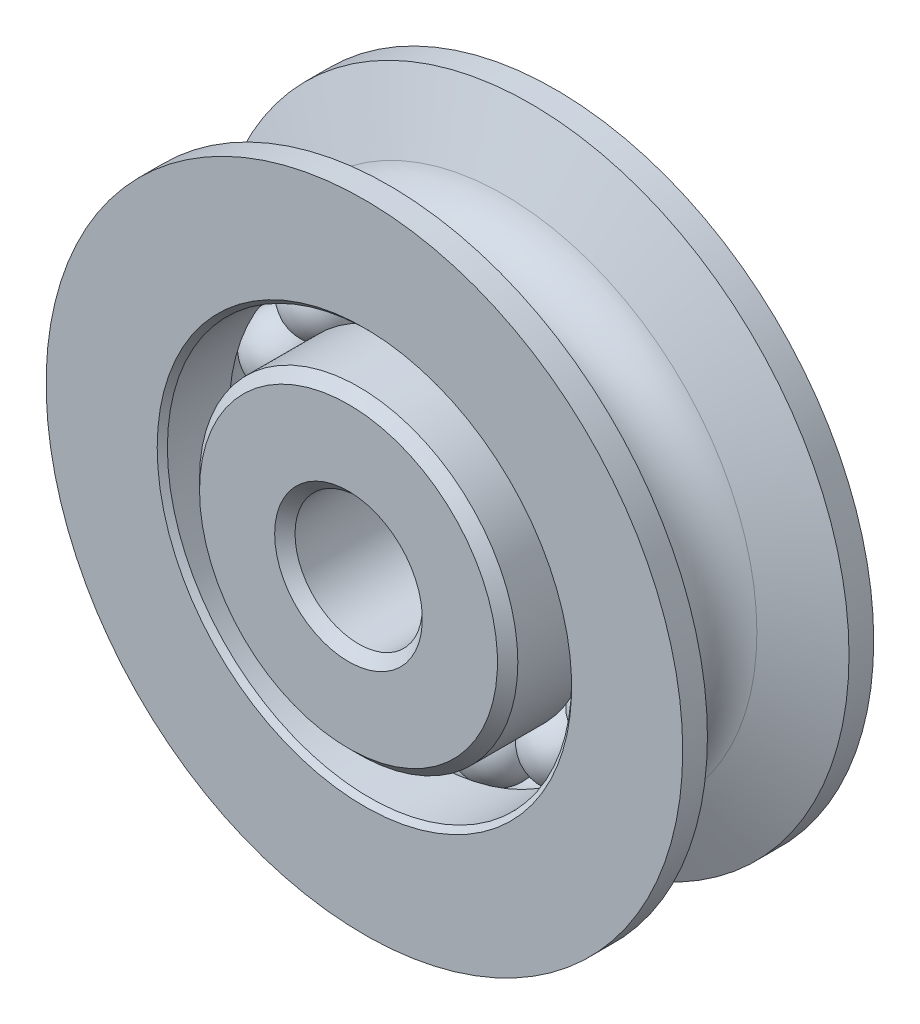
ISO-10303-21;
HEADER;
FILE_DESCRIPTION(('STEP AP214'),'2;1');
FILE_NAME('part.step','',(''),(''),'','','');
FILE_SCHEMA(('AUTOMOTIVE_DESIGN { 1 0 10303 214 1 1 1 1 }'));
ENDSEC;
DATA;
#1=APPLICATION_CONTEXT('core data for automotive mechanical design processes');
#2=APPLICATION_PROTOCOL_DEFINITION('international standard','automotive_design',2000,#1);
#3=PRODUCT_CONTEXT('',#1,'mechanical');
#4=PRODUCT('Part','Part','',(#3));
#5=PRODUCT_RELATED_PRODUCT_CATEGORY('part','',(#4));
#6=PRODUCT_DEFINITION_FORMATION('','',#4);
#7=PRODUCT_DEFINITION_CONTEXT('part definition',#1,'design');
#8=PRODUCT_DEFINITION('design','',#6,#7);
#9=PRODUCT_DEFINITION_SHAPE('','',#8);
#10=(LENGTH_UNIT() NAMED_UNIT(*) SI_UNIT(.MILLI.,.METRE.));
#11=(NAMED_UNIT(*) PLANE_ANGLE_UNIT() SI_UNIT($,.RADIAN.));
#12=(NAMED_UNIT(*) SI_UNIT($,.STERADIAN.) SOLID_ANGLE_UNIT());
#13=UNCERTAINTY_MEASURE_WITH_UNIT(LENGTH_MEASURE(1.E-05),#10,'distance_accuracy_value','');
#14=(GEOMETRIC_REPRESENTATION_CONTEXT(3) GLOBAL_UNCERTAINTY_ASSIGNED_CONTEXT((#13)) GLOBAL_UNIT_ASSIGNED_CONTEXT((#10,
#11,#12)) REPRESENTATION_CONTEXT('',''));
#15=CARTESIAN_POINT('',(0.,0.,0.));
#16=DIRECTION('',(0.,0.,1.));
#17=DIRECTION('',(1.,0.,0.));
#18=AXIS2_PLACEMENT_3D('',#15,#16,#17);
#19=CARTESIAN_POINT('',(3.66431583850997,8.23018812449334,0.));
#20=DIRECTION('',(0.406736643075789,0.913545457642606,0.));
#21=DIRECTION('',(0.,0.,-1.));
#22=AXIS2_PLACEMENT_3D('',#19,#20,#21);
#23=SPHERICAL_SURFACE('',#22,1.7859375);
#24=CARTESIAN_POINT('',(4.39072206200314,9.86172321525193,0.));
#25=VERTEX_POINT('',#24);
#26=VERTEX_LOOP('',#25);
#27=FACE_BOUND('',#26,.T.);
#28=ADVANCED_FACE('F34',(#27),#23,.T.);
#29=CLOSED_SHELL('',(#28));
#30=MANIFOLD_SOLID_BREP('B2',#29);
#31=CARTESIAN_POINT('',(6.69503817927736,6.02823945334993,0.));
#32=DIRECTION('',(0.743144825477386,0.669130606358867,0.));
#33=DIRECTION('',(0.,0.,-1.));
#34=AXIS2_PLACEMENT_3D('',#31,#32,#33);
#35=SPHERICAL_SURFACE('',#34,1.7859375);
#36=CARTESIAN_POINT('',(8.02224839102838,7.22326489564397,0.));
#37=VERTEX_POINT('',#36);
#38=VERTEX_LOOP('',#37);
#39=FACE_BOUND('',#38,.T.);
#40=ADVANCED_FACE('F53',(#39),#35,.T.);
#41=CLOSED_SHELL('',(#40));
#42=MANIFOLD_SOLID_BREP('B6',#41);
#43=CARTESIAN_POINT('',(8.56812759633528,2.78395341588614,0.));
#44=DIRECTION('',(0.95105651629515,0.309016994374957,0.));
#45=DIRECTION('',(0.,0.,-1.));
#46=AXIS2_PLACEMENT_3D('',#43,#44,#45);
#47=SPHERICAL_SURFACE('',#46,1.7859375);
#48=CARTESIAN_POINT('',(10.2666550934061,3.33583845427766,0.));
#49=VERTEX_POINT('',#48);
#50=VERTEX_LOOP('',#49);
#51=FACE_BOUND('',#50,.T.);
#52=ADVANCED_FACE('F72',(#51),#47,.T.);
#53=CLOSED_SHELL('',(#52));
#54=MANIFOLD_SOLID_BREP('B30',#53);
#55=CARTESIAN_POINT('',(8.95970991299125,-0.941703458607156,0.));
#56=DIRECTION('',(0.994521895368274,-0.104528463267644,0.));
#57=DIRECTION('',(0.,0.,-1.));
#58=AXIS2_PLACEMENT_3D('',#55,#56,#57);
#59=SPHERICAL_SURFACE('',#58,1.7859375);
#60=CARTESIAN_POINT('',(10.7358638605005,-1.12838476097421,0.));
#61=VERTEX_POINT('',#60);
#62=VERTEX_LOOP('',#61);
#63=FACE_BOUND('',#62,.T.);
#64=ADVANCED_FACE('F91',(#63),#59,.T.);
#65=CLOSED_SHELL('',(#64));
#66=MANIFOLD_SOLID_BREP('B49',#65);
#67=CARTESIAN_POINT('',(7.80207698928179,-4.50453124999993,0.));
#68=DIRECTION('',(0.866025403784443,-0.499999999999992,0.));
#69=DIRECTION('',(0.,0.,-1.));
#70=AXIS2_PLACEMENT_3D('',#67,#68,#69);
#71=SPHERICAL_SURFACE('',#70,1.7859375);
#72=CARTESIAN_POINT('',(9.34874423385306,-5.39749999999991,0.));
#73=VERTEX_POINT('',#72);
#74=VERTEX_LOOP('',#73);
#75=FACE_BOUND('',#74,.T.);
#76=ADVANCED_FACE('F110',(#75),#71,.T.);
#77=CLOSED_SHELL('',(#76));
#78=MANIFOLD_SOLID_BREP('B68',#77);
#79=CARTESIAN_POINT('',(5.29539407448122,-7.28848466588601,0.));
#80=DIRECTION('',(0.58778525229248,-0.809016994374943,0.));
#81=DIRECTION('',(0.,0.,-1.));
#82=AXIS2_PLACEMENT_3D('',#79,#80,#81);
#83=SPHERICAL_SURFACE('',#82,1.7859375);
#84=CARTESIAN_POINT('',(6.34514179849732,-8.7333384542775,0.));
#85=VERTEX_POINT('',#84);
#86=VERTEX_LOOP('',#85);
#87=FACE_BOUND('',#86,.T.);
#88=ADVANCED_FACE('F129',(#87),#83,.T.);
#89=CLOSED_SHELL('',(#88));
#90=MANIFOLD_SOLID_BREP('B87',#89);
#91=CARTESIAN_POINT('',(1.87308941705793,-8.81219286923589,0.));
#92=DIRECTION('',(0.207911690817766,-0.978147600733804,0.));
#93=DIRECTION('',(0.,0.,-1.));
#94=AXIS2_PLACEMENT_3D('',#91,#92,#93);
#95=SPHERICAL_SURFACE('',#94,1.7859375);
#96=CARTESIAN_POINT('',(2.24440670237779,-10.5591033499214,0.));
#97=VERTEX_POINT('',#96);
#98=VERTEX_LOOP('',#97);
#99=FACE_BOUND('',#98,.T.);
#100=ADVANCED_FACE('F148',(#99),#95,.T.);
#101=CLOSED_SHELL('',(#100));
#102=MANIFOLD_SOLID_BREP('B106',#101);
#103=CARTESIAN_POINT('',(-1.87308941705781,-8.81219286923591,0.));
#104=DIRECTION('',(-0.207911690817753,-0.978147600733807,0.));
#105=DIRECTION('',(0.,0.,-1.));
#106=AXIS2_PLACEMENT_3D('',#103,#104,#105);
#107=SPHERICAL_SURFACE('',#106,1.7859375);
#108=CARTESIAN_POINT('',(-2.24440670237765,-10.5591033499214,0.));
#109=VERTEX_POINT('',#108);
#110=VERTEX_LOOP('',#109);
#111=FACE_BOUND('',#110,.T.);
#112=ADVANCED_FACE('F167',(#111),#107,.T.);
#113=CLOSED_SHELL('',(#112));
#114=MANIFOLD_SOLID_BREP('B125',#113);
#115=CARTESIAN_POINT('',(-5.29539407448112,-7.28848466588608,0.));
#116=DIRECTION('',(-0.587785252292469,-0.80901699437495,0.));
#117=DIRECTION('',(0.,0.,-1.));
#118=AXIS2_PLACEMENT_3D('',#115,#116,#117);
#119=SPHERICAL_SURFACE('',#118,1.7859375);
#120=CARTESIAN_POINT('',(-6.3451417984972,-8.73333845427759,0.));
#121=VERTEX_POINT('',#120);
#122=VERTEX_LOOP('',#121);
#123=FACE_BOUND('',#122,.T.);
#124=ADVANCED_FACE('F186',(#123),#119,.T.);
#125=CLOSED_SHELL('',(#124));
#126=MANIFOLD_SOLID_BREP('B144',#125);
#127=CARTESIAN_POINT('',(-7.80207698928172,-4.50453125000004,0.));
#128=DIRECTION('',(-0.866025403784436,-0.500000000000004,0.));
#129=DIRECTION('',(0.,0.,-1.));
#130=AXIS2_PLACEMENT_3D('',#127,#128,#129);
#131=SPHERICAL_SURFACE('',#130,1.7859375);
#132=CARTESIAN_POINT('',(-9.34874423385299,-5.39750000000004,0.));
#133=VERTEX_POINT('',#132);
#134=VERTEX_LOOP('',#133);
#135=FACE_BOUND('',#134,.T.);
#136=ADVANCED_FACE('F205',(#135),#131,.T.);
#137=CLOSED_SHELL('',(#136));
#138=MANIFOLD_SOLID_BREP('B163',#137);
#139=CARTESIAN_POINT('',(-8.95970991299123,-0.941703458607277,0.));
#140=DIRECTION('',(-0.994521895368273,-0.104528463267657,0.));
#141=DIRECTION('',(0.,0.,-1.));
#142=AXIS2_PLACEMENT_3D('',#139,#140,#141);
#143=SPHERICAL_SURFACE('',#142,1.7859375);
#144=CARTESIAN_POINT('',(-10.7358638605005,-1.12838476097436,0.));
#145=VERTEX_POINT('',#144);
#146=VERTEX_LOOP('',#145);
#147=FACE_BOUND('',#146,.T.);
#148=ADVANCED_FACE('F224',(#147),#143,.T.);
#149=CLOSED_SHELL('',(#148));
#150=MANIFOLD_SOLID_BREP('B182',#149);
#151=CARTESIAN_POINT('',(-8.56812759633531,2.78395341588603,0.));
#152=DIRECTION('',(-0.951056516295154,0.309016994374945,0.));
#153=DIRECTION('',(0.,0.,-1.));
#154=AXIS2_PLACEMENT_3D('',#151,#152,#153);
#155=SPHERICAL_SURFACE('',#154,1.7859375);
#156=CARTESIAN_POINT('',(-10.2666550934062,3.33583845427753,0.));
#157=VERTEX_POINT('',#156);
#158=VERTEX_LOOP('',#157);
#159=FACE_BOUND('',#158,.T.);
#160=ADVANCED_FACE('F243',(#159),#155,.T.);
#161=CLOSED_SHELL('',(#160));
#162=MANIFOLD_SOLID_BREP('B201',#161);
#163=CARTESIAN_POINT('',(-6.69503817927745,6.02823945334984,0.));
#164=DIRECTION('',(-0.743144825477395,0.669130606358857,0.));
#165=DIRECTION('',(0.,0.,-1.));
#166=AXIS2_PLACEMENT_3D('',#163,#164,#165);
#167=SPHERICAL_SURFACE('',#166,1.7859375);
#168=CARTESIAN_POINT('',(-8.02224839102848,7.22326489564386,0.));
#169=VERTEX_POINT('',#168);
#170=VERTEX_LOOP('',#169);
#171=FACE_BOUND('',#170,.T.);
#172=ADVANCED_FACE('F262',(#171),#167,.T.);
#173=CLOSED_SHELL('',(#172));
#174=MANIFOLD_SOLID_BREP('B220',#173);
#175=CARTESIAN_POINT('',(-3.66431583851008,8.23018812449329,0.));
#176=DIRECTION('',(-0.406736643075801,0.913545457642601,0.));
#177=DIRECTION('',(0.,0.,-1.));
#178=AXIS2_PLACEMENT_3D('',#175,#176,#177);
#179=SPHERICAL_SURFACE('',#178,1.7859375);
#180=CARTESIAN_POINT('',(-4.39072206200327,9.86172321525187,0.));
#181=VERTEX_POINT('',#180);
#182=VERTEX_LOOP('',#181);
#183=FACE_BOUND('',#182,.T.);
#184=ADVANCED_FACE('F281',(#183),#179,.T.);
#185=CLOSED_SHELL('',(#184));
#186=MANIFOLD_SOLID_BREP('B239',#185);
#187=CARTESIAN_POINT('',(0.,9.0090625,0.));
#188=DIRECTION('',(0.,1.,0.));
#189=DIRECTION('',(0.,0.,-1.));
#190=AXIS2_PLACEMENT_3D('',#187,#188,#189);
#191=SPHERICAL_SURFACE('',#190,1.7859375);
#192=CARTESIAN_POINT('',(0.,10.795,0.));
#193=VERTEX_POINT('',#192);
#194=VERTEX_LOOP('',#193);
#195=FACE_BOUND('',#194,.T.);
#196=ADVANCED_FACE('F302',(#195),#191,.T.);
#197=CLOSED_SHELL('',(#196));
#198=MANIFOLD_SOLID_BREP('B258',#197);
#199=CARTESIAN_POINT('',(0.,7.9375,5.55625));
#200=DIRECTION('',(0.,0.,-1.));
#201=DIRECTION('',(-1.,0.,0.));
#202=AXIS2_PLACEMENT_3D('',#199,#200,#201);
#203=PLANE('',#202);
#204=CARTESIAN_POINT('',(0.,0.,5.55625));
#205=DIRECTION('',(0.,0.,-1.));
#206=DIRECTION('',(-1.,0.,0.));
#207=AXIS2_PLACEMENT_3D('',#204,#205,#206);
#208=CIRCLE('',#207,7.4295);
#209=CARTESIAN_POINT('',(-7.4295,0.,5.55625));
#210=VERTEX_POINT('',#209);
#211=EDGE_CURVE('E329',#210,#210,#208,.F.);
#212=ORIENTED_EDGE('',*,*,#211,.T.);
#213=EDGE_LOOP('',(#212));
#214=FACE_BOUND('',#213,.T.);
#215=CARTESIAN_POINT('',(0.,0.,5.55625));
#216=DIRECTION('',(0.,0.,-1.));
#217=DIRECTION('',(-1.,0.,0.));
#218=AXIS2_PLACEMENT_3D('',#215,#216,#217);
#219=CIRCLE('',#218,3.683);
#220=CARTESIAN_POINT('',(-3.683,0.,5.55625));
#221=VERTEX_POINT('',#220);
#222=EDGE_CURVE('E333',#221,#221,#219,.T.);
#223=ORIENTED_EDGE('',*,*,#222,.T.);
#224=EDGE_LOOP('',(#223));
#225=FACE_BOUND('',#224,.T.);
#226=ADVANCED_FACE('F322',(#214,#225),#203,.F.);
#227=CARTESIAN_POINT('',(0.,0.,5.55625));
#228=DIRECTION('',(0.,0.,1.));
#229=DIRECTION('',(1.,0.,0.));
#230=AXIS2_PLACEMENT_3D('',#227,#228,#229);
#231=CYLINDRICAL_SURFACE('',#230,3.175);
#232=CARTESIAN_POINT('',(0.,0.,-5.04825));
#233=DIRECTION('',(0.,0.,1.));
#234=DIRECTION('',(1.,0.,0.));
#235=AXIS2_PLACEMENT_3D('',#232,#233,#234);
#236=CIRCLE('',#235,3.175);
#237=CARTESIAN_POINT('',(3.175,0.,-5.04825));
#238=VERTEX_POINT('',#237);
#239=EDGE_CURVE('E342',#238,#238,#236,.F.);
#240=ORIENTED_EDGE('',*,*,#239,.T.);
#241=EDGE_LOOP('',(#240));
#242=FACE_BOUND('',#241,.T.);
#243=CARTESIAN_POINT('',(0.,0.,5.04825));
#244=DIRECTION('',(0.,0.,-1.));
#245=DIRECTION('',(-1.,0.,0.));
#246=AXIS2_PLACEMENT_3D('',#243,#244,#245);
#247=CIRCLE('',#246,3.175);
#248=CARTESIAN_POINT('',(-3.175,0.,5.04825));
#249=VERTEX_POINT('',#248);
#250=EDGE_CURVE('E345',#249,#249,#247,.F.);
#251=ORIENTED_EDGE('',*,*,#250,.T.);
#252=EDGE_LOOP('',(#251));
#253=FACE_BOUND('',#252,.T.);
#254=ADVANCED_FACE('F377',(#242,#253),#231,.F.);
#255=CARTESIAN_POINT('',(0.,7.9375,-5.55625));
#256=DIRECTION('',(0.,0.,1.));
#257=DIRECTION('',(1.,0.,0.));
#258=AXIS2_PLACEMENT_3D('',#255,#256,#257);
#259=PLANE('',#258);
#260=CARTESIAN_POINT('',(0.,0.,-5.55625));
#261=DIRECTION('',(0.,0.,1.));
#262=DIRECTION('',(1.,0.,0.));
#263=AXIS2_PLACEMENT_3D('',#260,#261,#262);
#264=CIRCLE('',#263,3.683);
#265=CARTESIAN_POINT('',(3.683,0.,-5.55625));
#266=VERTEX_POINT('',#265);
#267=EDGE_CURVE('E348',#266,#266,#264,.T.);
#268=ORIENTED_EDGE('',*,*,#267,.T.);
#269=EDGE_LOOP('',(#268));
#270=FACE_BOUND('',#269,.T.);
#271=CARTESIAN_POINT('',(0.,0.,-5.55625));
#272=DIRECTION('',(0.,0.,1.));
#273=DIRECTION('',(1.,0.,0.));
#274=AXIS2_PLACEMENT_3D('',#271,#272,#273);
#275=CIRCLE('',#274,7.4295);
#276=CARTESIAN_POINT('',(7.4295,0.,-5.55625));
#277=VERTEX_POINT('',#276);
#278=EDGE_CURVE('E351',#277,#277,#275,.F.);
#279=ORIENTED_EDGE('',*,*,#278,.T.);
#280=EDGE_LOOP('',(#279));
#281=FACE_BOUND('',#280,.T.);
#282=ADVANCED_FACE('F371',(#270,#281),#259,.F.);
#283=CARTESIAN_POINT('',(0.,0.,5.55625));
#284=DIRECTION('',(0.,0.,1.));
#285=DIRECTION('',(1.,0.,0.));
#286=AXIS2_PLACEMENT_3D('',#283,#284,#285);
#287=CYLINDRICAL_SURFACE('',#286,7.9375);
#288=CARTESIAN_POINT('',(0.,0.,-5.04825));
#289=DIRECTION('',(0.,0.,1.));
#290=DIRECTION('',(1.,0.,0.));
#291=AXIS2_PLACEMENT_3D('',#288,#289,#290);
#292=CIRCLE('',#291,7.9375);
#293=CARTESIAN_POINT('',(7.9375,0.,-5.04825));
#294=VERTEX_POINT('',#293);
#295=EDGE_CURVE('E337',#294,#294,#292,.T.);
#296=ORIENTED_EDGE('',*,*,#295,.T.);
#297=EDGE_LOOP('',(#296));
#298=FACE_BOUND('',#297,.T.);
#299=CARTESIAN_POINT('',(0.,0.,-1.42875));
#300=DIRECTION('',(0.,0.,1.));
#301=DIRECTION('',(1.,0.,0.));
#302=AXIS2_PLACEMENT_3D('',#299,#300,#301);
#303=CIRCLE('',#302,7.9375);
#304=CARTESIAN_POINT('',(7.9375,0.,-1.42875));
#305=VERTEX_POINT('',#304);
#306=EDGE_CURVE('E354',#305,#305,#303,.T.);
#307=ORIENTED_EDGE('',*,*,#306,.F.);
#308=EDGE_LOOP('',(#307));
#309=FACE_BOUND('',#308,.T.);
#310=ADVANCED_FACE('F366',(#298,#309),#287,.T.);
#311=CARTESIAN_POINT('',(0.,0.,0.));
#312=DIRECTION('',(0.,0.,1.));
#313=DIRECTION('',(1.,0.,0.));
#314=AXIS2_PLACEMENT_3D('',#311,#312,#313);
#315=TOROIDAL_SURFACE('',#314,9.0090625,1.7859375);
#316=CARTESIAN_POINT('',(0.,0.,1.42875));
#317=DIRECTION('',(0.,0.,1.));
#318=DIRECTION('',(1.,0.,0.));
#319=AXIS2_PLACEMENT_3D('',#316,#317,#318);
#320=CIRCLE('',#319,7.9375);
#321=CARTESIAN_POINT('',(7.9375,0.,1.42875));
#322=VERTEX_POINT('',#321);
#323=EDGE_CURVE('E357',#322,#322,#320,.T.);
#324=ORIENTED_EDGE('',*,*,#323,.F.);
#325=EDGE_LOOP('',(#324));
#326=FACE_BOUND('',#325,.T.);
#327=ORIENTED_EDGE('',*,*,#306,.T.);
#328=EDGE_LOOP('',(#327));
#329=FACE_BOUND('',#328,.T.);
#330=ADVANCED_FACE('F363',(#326,#329),#315,.F.);
#331=CARTESIAN_POINT('',(0.,0.,5.55625));
#332=DIRECTION('',(0.,0.,1.));
#333=DIRECTION('',(1.,0.,0.));
#334=AXIS2_PLACEMENT_3D('',#331,#332,#333);
#335=CYLINDRICAL_SURFACE('',#334,7.9375);
#336=CARTESIAN_POINT('',(0.,0.,5.04825));
#337=DIRECTION('',(0.,0.,-1.));
#338=DIRECTION('',(-1.,0.,0.));
#339=AXIS2_PLACEMENT_3D('',#336,#337,#338);
#340=CIRCLE('',#339,7.9375);
#341=CARTESIAN_POINT('',(-7.9375,0.,5.04825));
#342=VERTEX_POINT('',#341);
#343=EDGE_CURVE('E301',#342,#342,#340,.T.);
#344=ORIENTED_EDGE('',*,*,#343,.T.);
#345=EDGE_LOOP('',(#344));
#346=FACE_BOUND('',#345,.T.);
#347=ORIENTED_EDGE('',*,*,#323,.T.);
#348=EDGE_LOOP('',(#347));
#349=FACE_BOUND('',#348,.T.);
#350=ADVANCED_FACE('F361',(#346,#349),#335,.T.);
#351=CARTESIAN_POINT('',(0.,0.,-5.55625));
#352=DIRECTION('',(0.,0.,-1.));
#353=DIRECTION('',(-1.,0.,0.));
#354=AXIS2_PLACEMENT_3D('',#351,#352,#353);
#355=CONICAL_SURFACE('',#354,3.683,0.785398163397446);
#356=ORIENTED_EDGE('',*,*,#239,.F.);
#357=EDGE_LOOP('',(#356));
#358=FACE_BOUND('',#357,.T.);
#359=ORIENTED_EDGE('',*,*,#267,.F.);
#360=EDGE_LOOP('',(#359));
#361=FACE_BOUND('',#360,.T.);
#362=ADVANCED_FACE('F389',(#358,#361),#355,.F.);
#363=CARTESIAN_POINT('',(0.,0.,-5.04825));
#364=DIRECTION('',(0.,0.,1.));
#365=DIRECTION('',(1.,0.,0.));
#366=AXIS2_PLACEMENT_3D('',#363,#364,#365);
#367=CONICAL_SURFACE('',#366,7.9375,0.785398163397448);
#368=ORIENTED_EDGE('',*,*,#278,.F.);
#369=EDGE_LOOP('',(#368));
#370=FACE_BOUND('',#369,.T.);
#371=ORIENTED_EDGE('',*,*,#295,.F.);
#372=EDGE_LOOP('',(#371));
#373=FACE_BOUND('',#372,.T.);
#374=ADVANCED_FACE('F392',(#370,#373),#367,.T.);
#375=CARTESIAN_POINT('',(0.,0.,5.55625));
#376=DIRECTION('',(0.,0.,-1.));
#377=DIRECTION('',(-1.,0.,0.));
#378=AXIS2_PLACEMENT_3D('',#375,#376,#377);
#379=CONICAL_SURFACE('',#378,7.4295,0.785398163397448);
#380=ORIENTED_EDGE('',*,*,#343,.F.);
#381=EDGE_LOOP('',(#380));
#382=FACE_BOUND('',#381,.T.);
#383=ORIENTED_EDGE('',*,*,#211,.F.);
#384=EDGE_LOOP('',(#383));
#385=FACE_BOUND('',#384,.T.);
#386=ADVANCED_FACE('F395',(#382,#385),#379,.T.);
#387=CARTESIAN_POINT('',(0.,0.,5.04825));
#388=DIRECTION('',(0.,0.,1.));
#389=DIRECTION('',(1.,0.,0.));
#390=AXIS2_PLACEMENT_3D('',#387,#388,#389);
#391=CONICAL_SURFACE('',#390,3.175,0.785398163397448);
#392=ORIENTED_EDGE('',*,*,#222,.F.);
#393=EDGE_LOOP('',(#392));
#394=FACE_BOUND('',#393,.T.);
#395=ORIENTED_EDGE('',*,*,#250,.F.);
#396=EDGE_LOOP('',(#395));
#397=FACE_BOUND('',#396,.T.);
#398=ADVANCED_FACE('F324',(#394,#397),#391,.F.);
#399=CLOSED_SHELL('',(#226,#254,#282,#310,#330,#350,#362,#374,#386,#398));
#400=MANIFOLD_SOLID_BREP('B277',#399);
#401=CARTESIAN_POINT('',(0.,0.,0.));
#402=DIRECTION('',(0.,0.,1.));
#403=DIRECTION('',(1.,0.,0.));
#404=AXIS2_PLACEMENT_3D('',#401,#402,#403);
#405=TOROIDAL_SURFACE('',#404,13.49375,2.38125);
#406=CARTESIAN_POINT('',(0.,0.,2.20779758582892));
#407=DIRECTION('',(0.,0.,1.));
#408=DIRECTION('',(1.,0.,0.));
#409=AXIS2_PLACEMENT_3D('',#406,#407,#408);
#410=CIRCLE('',#409,12.6015721127443);
#411=CARTESIAN_POINT('',(12.6015721127443,0.,2.20779758582892));
#412=VERTEX_POINT('',#411);
#413=EDGE_CURVE('E494',#412,#412,#410,.T.);
#414=ORIENTED_EDGE('',*,*,#413,.F.);
#415=EDGE_LOOP('',(#414));
#416=FACE_BOUND('',#415,.T.);
#417=CARTESIAN_POINT('',(0.,0.,-2.20779758582892));
#418=DIRECTION('',(0.,0.,1.));
#419=DIRECTION('',(1.,0.,0.));
#420=AXIS2_PLACEMENT_3D('',#417,#418,#419);
#421=CIRCLE('',#420,12.6015721127443);
#422=CARTESIAN_POINT('',(12.6015721127443,0.,-2.20779758582892));
#423=VERTEX_POINT('',#422);
#424=EDGE_CURVE('E515',#423,#423,#421,.T.);
#425=ORIENTED_EDGE('',*,*,#424,.T.);
#426=EDGE_LOOP('',(#425));
#427=FACE_BOUND('',#426,.T.);
#428=ADVANCED_FACE('F474',(#416,#427),#405,.F.);
#429=CARTESIAN_POINT('',(0.,0.,2.20779758582892));
#430=DIRECTION('',(0.,0.,1.));
#431=DIRECTION('',(1.,0.,0.));
#432=AXIS2_PLACEMENT_3D('',#429,#430,#431);
#433=CONICAL_SURFACE('',#432,12.6015721127443,1.18675779166655);
#434=CARTESIAN_POINT('',(0.,0.,3.5306));
#435=DIRECTION('',(0.,0.,1.));
#436=DIRECTION('',(1.,0.,0.));
#437=AXIS2_PLACEMENT_3D('',#434,#435,#436);
#438=CIRCLE('',#437,15.875);
#439=CARTESIAN_POINT('',(15.875,0.,3.5306));
#440=VERTEX_POINT('',#439);
#441=EDGE_CURVE('E497',#440,#440,#438,.T.);
#442=ORIENTED_EDGE('',*,*,#441,.F.);
#443=EDGE_LOOP('',(#442));
#444=FACE_BOUND('',#443,.T.);
#445=ORIENTED_EDGE('',*,*,#413,.T.);
#446=EDGE_LOOP('',(#445));
#447=FACE_BOUND('',#446,.T.);
#448=ADVANCED_FACE('F545',(#444,#447),#433,.T.);
#449=CARTESIAN_POINT('',(0.,0.,5.55625));
#450=DIRECTION('',(0.,0.,1.));
#451=DIRECTION('',(1.,0.,0.));
#452=AXIS2_PLACEMENT_3D('',#449,#450,#451);
#453=CYLINDRICAL_SURFACE('',#452,15.875);
#454=CARTESIAN_POINT('',(0.,0.,4.7625));
#455=DIRECTION('',(0.,0.,1.));
#456=DIRECTION('',(1.,0.,0.));
#457=AXIS2_PLACEMENT_3D('',#454,#455,#456);
#458=CIRCLE('',#457,15.875);
#459=CARTESIAN_POINT('',(15.875,0.,4.7625));
#460=VERTEX_POINT('',#459);
#461=EDGE_CURVE('E500',#460,#460,#458,.T.);
#462=ORIENTED_EDGE('',*,*,#461,.F.);
#463=EDGE_LOOP('',(#462));
#464=FACE_BOUND('',#463,.T.);
#465=ORIENTED_EDGE('',*,*,#441,.T.);
#466=EDGE_LOOP('',(#465));
#467=FACE_BOUND('',#466,.T.);
#468=ADVANCED_FACE('F551',(#464,#467),#453,.T.);
#469=CARTESIAN_POINT('',(0.,10.080625,4.7625));
#470=DIRECTION('',(0.,0.,-1.));
#471=DIRECTION('',(-1.,0.,0.));
#472=AXIS2_PLACEMENT_3D('',#469,#470,#471);
#473=PLANE('',#472);
#474=CARTESIAN_POINT('',(0.,0.,4.7625));
#475=DIRECTION('',(0.,0.,-1.));
#476=DIRECTION('',(-1.,0.,0.));
#477=AXIS2_PLACEMENT_3D('',#474,#475,#476);
#478=CIRCLE('',#477,10.334625);
#479=CARTESIAN_POINT('',(-10.334625,0.,4.7625));
#480=VERTEX_POINT('',#479);
#481=EDGE_CURVE('E321',#480,#480,#478,.T.);
#482=ORIENTED_EDGE('',*,*,#481,.T.);
#483=EDGE_LOOP('',(#482));
#484=FACE_BOUND('',#483,.T.);
#485=ORIENTED_EDGE('',*,*,#461,.T.);
#486=EDGE_LOOP('',(#485));
#487=FACE_BOUND('',#486,.T.);
#488=ADVANCED_FACE('F575',(#484,#487),#473,.F.);
#489=CARTESIAN_POINT('',(0.,0.,5.55625));
#490=DIRECTION('',(0.,0.,1.));
#491=DIRECTION('',(1.,0.,0.));
#492=AXIS2_PLACEMENT_3D('',#489,#490,#491);
#493=CYLINDRICAL_SURFACE('',#492,10.080625);
#494=CARTESIAN_POINT('',(0.,0.,4.50849999999999));
#495=DIRECTION('',(0.,0.,-1.));
#496=DIRECTION('',(-1.,0.,0.));
#497=AXIS2_PLACEMENT_3D('',#494,#495,#496);
#498=CIRCLE('',#497,10.080625);
#499=CARTESIAN_POINT('',(-10.080625,0.,4.50849999999999));
#500=VERTEX_POINT('',#499);
#501=EDGE_CURVE('E481',#500,#500,#498,.F.);
#502=ORIENTED_EDGE('',*,*,#501,.T.);
#503=EDGE_LOOP('',(#502));
#504=FACE_BOUND('',#503,.T.);
#505=CARTESIAN_POINT('',(0.,0.,1.42875));
#506=DIRECTION('',(0.,0.,1.));
#507=DIRECTION('',(1.,0.,0.));
#508=AXIS2_PLACEMENT_3D('',#505,#506,#507);
#509=CIRCLE('',#508,10.080625);
#510=CARTESIAN_POINT('',(10.080625,0.,1.42875));
#511=VERTEX_POINT('',#510);
#512=EDGE_CURVE('E503',#511,#511,#509,.T.);
#513=ORIENTED_EDGE('',*,*,#512,.F.);
#514=EDGE_LOOP('',(#513));
#515=FACE_BOUND('',#514,.T.);
#516=ADVANCED_FACE('F570',(#504,#515),#493,.F.);
#517=CARTESIAN_POINT('',(0.,0.,0.));
#518=DIRECTION('',(0.,0.,1.));
#519=DIRECTION('',(1.,0.,0.));
#520=AXIS2_PLACEMENT_3D('',#517,#518,#519);
#521=TOROIDAL_SURFACE('',#520,9.0090625,1.7859375);
#522=CARTESIAN_POINT('',(0.,0.,-1.42875));
#523=DIRECTION('',(0.,0.,1.));
#524=DIRECTION('',(1.,0.,0.));
#525=AXIS2_PLACEMENT_3D('',#522,#523,#524);
#526=CIRCLE('',#525,10.080625);
#527=CARTESIAN_POINT('',(10.080625,0.,-1.42875));
#528=VERTEX_POINT('',#527);
#529=EDGE_CURVE('E506',#528,#528,#526,.T.);
#530=ORIENTED_EDGE('',*,*,#529,.F.);
#531=EDGE_LOOP('',(#530));
#532=FACE_BOUND('',#531,.T.);
#533=ORIENTED_EDGE('',*,*,#512,.T.);
#534=EDGE_LOOP('',(#533));
#535=FACE_BOUND('',#534,.T.);
#536=ADVANCED_FACE('F541',(#532,#535),#521,.F.);
#537=CARTESIAN_POINT('',(0.,0.,5.55625));
#538=DIRECTION('',(0.,0.,1.));
#539=DIRECTION('',(1.,0.,0.));
#540=AXIS2_PLACEMENT_3D('',#537,#538,#539);
#541=CYLINDRICAL_SURFACE('',#540,10.080625);
#542=CARTESIAN_POINT('',(0.,0.,-4.50849999999999));
#543=DIRECTION('',(0.,0.,1.));
#544=DIRECTION('',(1.,0.,0.));
#545=AXIS2_PLACEMENT_3D('',#542,#543,#544);
#546=CIRCLE('',#545,10.080625);
#547=CARTESIAN_POINT('',(10.080625,0.,-4.50849999999999));
#548=VERTEX_POINT('',#547);
#549=EDGE_CURVE('E485',#548,#548,#546,.F.);
#550=ORIENTED_EDGE('',*,*,#549,.T.);
#551=EDGE_LOOP('',(#550));
#552=FACE_BOUND('',#551,.T.);
#553=ORIENTED_EDGE('',*,*,#529,.T.);
#554=EDGE_LOOP('',(#553));
#555=FACE_BOUND('',#554,.T.);
#556=ADVANCED_FACE('F535',(#552,#555),#541,.F.);
#557=CARTESIAN_POINT('',(0.,15.875,-4.7625));
#558=DIRECTION('',(0.,0.,1.));
#559=DIRECTION('',(1.,0.,0.));
#560=AXIS2_PLACEMENT_3D('',#557,#558,#559);
#561=PLANE('',#560);
#562=CARTESIAN_POINT('',(0.,0.,-4.7625));
#563=DIRECTION('',(0.,0.,1.));
#564=DIRECTION('',(1.,0.,0.));
#565=AXIS2_PLACEMENT_3D('',#562,#563,#564);
#566=CIRCLE('',#565,10.334625);
#567=CARTESIAN_POINT('',(10.334625,0.,-4.7625));
#568=VERTEX_POINT('',#567);
#569=EDGE_CURVE('E489',#568,#568,#566,.T.);
#570=ORIENTED_EDGE('',*,*,#569,.T.);
#571=EDGE_LOOP('',(#570));
#572=FACE_BOUND('',#571,.T.);
#573=CARTESIAN_POINT('',(0.,0.,-4.7625));
#574=DIRECTION('',(0.,0.,1.));
#575=DIRECTION('',(1.,0.,0.));
#576=AXIS2_PLACEMENT_3D('',#573,#574,#575);
#577=CIRCLE('',#576,15.875);
#578=CARTESIAN_POINT('',(15.875,0.,-4.7625));
#579=VERTEX_POINT('',#578);
#580=EDGE_CURVE('E509',#579,#579,#577,.T.);
#581=ORIENTED_EDGE('',*,*,#580,.F.);
#582=EDGE_LOOP('',(#581));
#583=FACE_BOUND('',#582,.T.);
#584=ADVANCED_FACE('F530',(#572,#583),#561,.F.);
#585=CARTESIAN_POINT('',(0.,0.,5.55625));
#586=DIRECTION('',(0.,0.,1.));
#587=DIRECTION('',(1.,0.,0.));
#588=AXIS2_PLACEMENT_3D('',#585,#586,#587);
#589=CYLINDRICAL_SURFACE('',#588,15.875);
#590=CARTESIAN_POINT('',(0.,0.,-3.5306));
#591=DIRECTION('',(0.,0.,1.));
#592=DIRECTION('',(1.,0.,0.));
#593=AXIS2_PLACEMENT_3D('',#590,#591,#592);
#594=CIRCLE('',#593,15.875);
#595=CARTESIAN_POINT('',(15.875,0.,-3.5306));
#596=VERTEX_POINT('',#595);
#597=EDGE_CURVE('E512',#596,#596,#594,.T.);
#598=ORIENTED_EDGE('',*,*,#597,.F.);
#599=EDGE_LOOP('',(#598));
#600=FACE_BOUND('',#599,.T.);
#601=ORIENTED_EDGE('',*,*,#580,.T.);
#602=EDGE_LOOP('',(#601));
#603=FACE_BOUND('',#602,.T.);
#604=ADVANCED_FACE('F524',(#600,#603),#589,.T.);
#605=CARTESIAN_POINT('',(0.,0.,-3.5306));
#606=DIRECTION('',(0.,0.,-1.));
#607=DIRECTION('',(-1.,0.,0.));
#608=AXIS2_PLACEMENT_3D('',#605,#606,#607);
#609=CONICAL_SURFACE('',#608,15.875,1.18675779166655);
#610=ORIENTED_EDGE('',*,*,#424,.F.);
#611=EDGE_LOOP('',(#610));
#612=FACE_BOUND('',#611,.T.);
#613=ORIENTED_EDGE('',*,*,#597,.T.);
#614=EDGE_LOOP('',(#613));
#615=FACE_BOUND('',#614,.T.);
#616=ADVANCED_FACE('F520',(#612,#615),#609,.T.);
#617=CARTESIAN_POINT('',(0.,0.,-4.7625));
#618=DIRECTION('',(0.,0.,-1.));
#619=DIRECTION('',(-1.,0.,0.));
#620=AXIS2_PLACEMENT_3D('',#617,#618,#619);
#621=CONICAL_SURFACE('',#620,10.334625,0.785398163397442);
#622=ORIENTED_EDGE('',*,*,#549,.F.);
#623=EDGE_LOOP('',(#622));
#624=FACE_BOUND('',#623,.T.);
#625=ORIENTED_EDGE('',*,*,#569,.F.);
#626=EDGE_LOOP('',(#625));
#627=FACE_BOUND('',#626,.T.);
#628=ADVANCED_FACE('F523',(#624,#627),#621,.F.);
#629=CARTESIAN_POINT('',(0.,0.,4.50849999999999));
#630=DIRECTION('',(0.,0.,1.));
#631=DIRECTION('',(1.,0.,0.));
#632=AXIS2_PLACEMENT_3D('',#629,#630,#631);
#633=CONICAL_SURFACE('',#632,10.080625,0.785398163397462);
#634=ORIENTED_EDGE('',*,*,#481,.F.);
#635=EDGE_LOOP('',(#634));
#636=FACE_BOUND('',#635,.T.);
#637=ORIENTED_EDGE('',*,*,#501,.F.);
#638=EDGE_LOOP('',(#637));
#639=FACE_BOUND('',#638,.T.);
#640=ADVANCED_FACE('F476',(#636,#639),#633,.F.);
#641=CLOSED_SHELL('',(#428,#448,#468,#488,#516,#536,#556,#584,#604,#616,#628,#640));
#642=MANIFOLD_SOLID_BREP('B296',#641);
#643=ADVANCED_BREP_SHAPE_REPRESENTATION('',(#18,#30,#42,#54,#66,#78,#90,#102,#114,#126,#138,
#150,#162,#174,#186,#198,#400,#642),#14);
#644=SHAPE_DEFINITION_REPRESENTATION(#9,#643);
ENDSEC;
END-ISO-10303-21;
